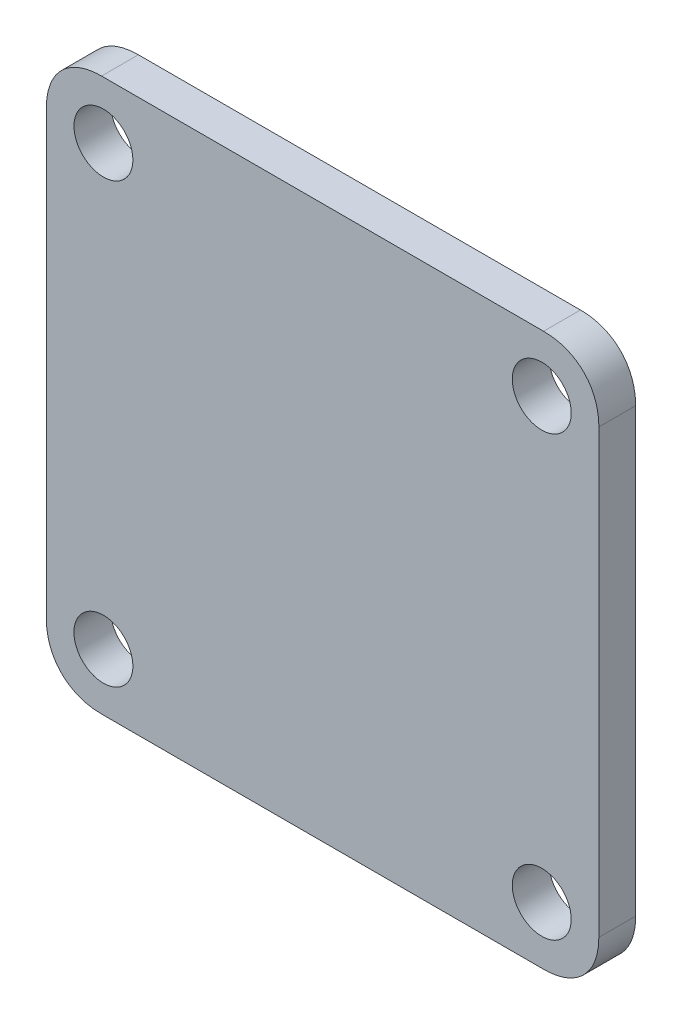
ISO-10303-21;
HEADER;
FILE_DESCRIPTION(('STEP AP214'),'2;1');
FILE_NAME('part.step','',(''),(''),'','','');
FILE_SCHEMA(('AUTOMOTIVE_DESIGN { 1 0 10303 214 1 1 1 1 }'));
ENDSEC;
DATA;
#1=APPLICATION_CONTEXT('core data for automotive mechanical design processes');
#2=APPLICATION_PROTOCOL_DEFINITION('international standard','automotive_design',2000,#1);
#3=PRODUCT_CONTEXT('',#1,'mechanical');
#4=PRODUCT('Part','Part','',(#3));
#5=PRODUCT_RELATED_PRODUCT_CATEGORY('part','',(#4));
#6=PRODUCT_DEFINITION_FORMATION('','',#4);
#7=PRODUCT_DEFINITION_CONTEXT('part definition',#1,'design');
#8=PRODUCT_DEFINITION('design','',#6,#7);
#9=PRODUCT_DEFINITION_SHAPE('','',#8);
#10=(LENGTH_UNIT() NAMED_UNIT(*) SI_UNIT(.MILLI.,.METRE.));
#11=(NAMED_UNIT(*) PLANE_ANGLE_UNIT() SI_UNIT($,.RADIAN.));
#12=(NAMED_UNIT(*) SI_UNIT($,.STERADIAN.) SOLID_ANGLE_UNIT());
#13=UNCERTAINTY_MEASURE_WITH_UNIT(LENGTH_MEASURE(1.E-05),#10,'distance_accuracy_value','');
#14=(GEOMETRIC_REPRESENTATION_CONTEXT(3) GLOBAL_UNCERTAINTY_ASSIGNED_CONTEXT((#13)) GLOBAL_UNIT_ASSIGNED_CONTEXT((#10,
#11,#12)) REPRESENTATION_CONTEXT('',''));
#15=CARTESIAN_POINT('',(0.,0.,0.));
#16=DIRECTION('',(0.,0.,1.));
#17=DIRECTION('',(1.,0.,0.));
#18=AXIS2_PLACEMENT_3D('',#15,#16,#17);
#19=CARTESIAN_POINT('',(0.,0.,2.));
#20=DIRECTION('',(0.,0.,1.));
#21=DIRECTION('',(1.,0.,0.));
#22=AXIS2_PLACEMENT_3D('',#19,#20,#21);
#23=PLANE('',#22);
#24=CARTESIAN_POINT('',(11.8999580326409,-11.8999580326409,2.));
#25=DIRECTION('',(0.,0.,1.));
#26=DIRECTION('',(1.,0.,0.));
#27=AXIS2_PLACEMENT_3D('',#24,#25,#26);
#28=CIRCLE('',#27,1.6);
#29=CARTESIAN_POINT('',(13.4999580326409,-11.8999580326409,2.));
#30=VERTEX_POINT('',#29);
#31=EDGE_CURVE('E273',#30,#30,#28,.T.);
#32=ORIENTED_EDGE('',*,*,#31,.F.);
#33=EDGE_LOOP('',(#32));
#34=FACE_BOUND('',#33,.T.);
#35=CARTESIAN_POINT('',(-11.8999580326409,11.8999580326409,2.));
#36=DIRECTION('',(0.,0.,1.));
#37=DIRECTION('',(1.,0.,0.));
#38=AXIS2_PLACEMENT_3D('',#35,#36,#37);
#39=CIRCLE('',#38,1.6);
#40=CARTESIAN_POINT('',(-10.2999580326409,11.8999580326409,2.));
#41=VERTEX_POINT('',#40);
#42=EDGE_CURVE('E178',#41,#41,#39,.T.);
#43=ORIENTED_EDGE('',*,*,#42,.F.);
#44=EDGE_LOOP('',(#43));
#45=FACE_BOUND('',#44,.T.);
#46=DIRECTION('',(0.,-1.,0.));
#47=VECTOR('',#46,1.);
#48=CARTESIAN_POINT('',(-15.,15.,2.));
#49=LINE('',#48,#47);
#50=CARTESIAN_POINT('',(-15.,12.,2.));
#51=VERTEX_POINT('',#50);
#52=CARTESIAN_POINT('',(-15.,-12.,2.));
#53=VERTEX_POINT('',#52);
#54=EDGE_CURVE('E166',#51,#53,#49,.T.);
#55=ORIENTED_EDGE('',*,*,#54,.T.);
#56=CARTESIAN_POINT('',(-12.,-15.,2.));
#57=CARTESIAN_POINT('',(-15.,-15.,2.));
#58=CARTESIAN_POINT('',(-15.,-12.,2.));
#59=(BOUNDED_CURVE() B_SPLINE_CURVE(2,(#56,#57,#58),.UNSPECIFIED.,.F.,
.F.) B_SPLINE_CURVE_WITH_KNOTS((3,3),(0.,1.),
.UNSPECIFIED.) CURVE() GEOMETRIC_REPRESENTATION_ITEM() RATIONAL_B_SPLINE_CURVE((1.,
0.818181818181818,1.)) REPRESENTATION_ITEM(''));
#60=CARTESIAN_POINT('',(-12.,-15.,2.));
#61=VERTEX_POINT('',#60);
#62=EDGE_CURVE('E464',#53,#61,#59,.F.);
#63=ORIENTED_EDGE('',*,*,#62,.T.);
#64=DIRECTION('',(1.,0.,0.));
#65=VECTOR('',#64,1.);
#66=CARTESIAN_POINT('',(-15.,-15.,2.));
#67=LINE('',#66,#65);
#68=CARTESIAN_POINT('',(12.,-15.,2.));
#69=VERTEX_POINT('',#68);
#70=EDGE_CURVE('E144',#61,#69,#67,.T.);
#71=ORIENTED_EDGE('',*,*,#70,.T.);
#72=CARTESIAN_POINT('',(15.,-12.,2.));
#73=CARTESIAN_POINT('',(15.,-15.,2.));
#74=CARTESIAN_POINT('',(12.,-15.,2.));
#75=(BOUNDED_CURVE() B_SPLINE_CURVE(2,(#72,#73,#74),.UNSPECIFIED.,.F.,
.F.) B_SPLINE_CURVE_WITH_KNOTS((3,3),(0.,1.),
.UNSPECIFIED.) CURVE() GEOMETRIC_REPRESENTATION_ITEM() RATIONAL_B_SPLINE_CURVE((1.,
0.818181818181818,1.)) REPRESENTATION_ITEM(''));
#76=CARTESIAN_POINT('',(15.,-12.,2.));
#77=VERTEX_POINT('',#76);
#78=EDGE_CURVE('E532',#69,#77,#75,.F.);
#79=ORIENTED_EDGE('',*,*,#78,.T.);
#80=DIRECTION('',(0.,1.,0.));
#81=VECTOR('',#80,1.);
#82=CARTESIAN_POINT('',(15.,15.,2.));
#83=LINE('',#82,#81);
#84=CARTESIAN_POINT('',(15.,12.,2.));
#85=VERTEX_POINT('',#84);
#86=EDGE_CURVE('E153',#77,#85,#83,.T.);
#87=ORIENTED_EDGE('',*,*,#86,.T.);
#88=CARTESIAN_POINT('',(12.,15.,2.));
#89=CARTESIAN_POINT('',(15.,15.,2.));
#90=CARTESIAN_POINT('',(15.,12.,2.));
#91=(BOUNDED_CURVE() B_SPLINE_CURVE(2,(#88,#89,#90),.UNSPECIFIED.,.F.,
.F.) B_SPLINE_CURVE_WITH_KNOTS((3,3),(0.,1.),
.UNSPECIFIED.) CURVE() GEOMETRIC_REPRESENTATION_ITEM() RATIONAL_B_SPLINE_CURVE((1.,
0.818181818181818,1.)) REPRESENTATION_ITEM(''));
#92=CARTESIAN_POINT('',(12.,15.,2.));
#93=VERTEX_POINT('',#92);
#94=EDGE_CURVE('E72',#85,#93,#91,.F.);
#95=ORIENTED_EDGE('',*,*,#94,.T.);
#96=DIRECTION('',(-1.,0.,0.));
#97=VECTOR('',#96,1.);
#98=CARTESIAN_POINT('',(-15.,15.,2.));
#99=LINE('',#98,#97);
#100=CARTESIAN_POINT('',(-12.,15.,2.));
#101=VERTEX_POINT('',#100);
#102=EDGE_CURVE('E156',#93,#101,#99,.T.);
#103=ORIENTED_EDGE('',*,*,#102,.T.);
#104=CARTESIAN_POINT('',(-15.,12.,2.));
#105=CARTESIAN_POINT('',(-15.,15.,2.));
#106=CARTESIAN_POINT('',(-12.,15.,2.));
#107=(BOUNDED_CURVE() B_SPLINE_CURVE(2,(#104,#105,#106),.UNSPECIFIED.,.F.,
.F.) B_SPLINE_CURVE_WITH_KNOTS((3,3),(0.,1.),
.UNSPECIFIED.) CURVE() GEOMETRIC_REPRESENTATION_ITEM() RATIONAL_B_SPLINE_CURVE((1.,
0.818181818181818,1.)) REPRESENTATION_ITEM(''));
#108=EDGE_CURVE('E584',#101,#51,#107,.F.);
#109=ORIENTED_EDGE('',*,*,#108,.T.);
#110=EDGE_LOOP('',(#55,#63,#71,#79,#87,#95,#103,#109));
#111=FACE_BOUND('',#110,.T.);
#112=CARTESIAN_POINT('',(11.8999580326409,11.8999580326409,2.));
#113=DIRECTION('',(0.,0.,1.));
#114=DIRECTION('',(-1.,0.,0.));
#115=AXIS2_PLACEMENT_3D('',#112,#113,#114);
#116=CIRCLE('',#115,1.6);
#117=CARTESIAN_POINT('',(10.2999580326409,11.8999580326409,2.));
#118=VERTEX_POINT('',#117);
#119=EDGE_CURVE('E267',#118,#118,#116,.T.);
#120=ORIENTED_EDGE('',*,*,#119,.F.);
#121=EDGE_LOOP('',(#120));
#122=FACE_BOUND('',#121,.T.);
#123=CARTESIAN_POINT('',(-11.8999580326409,-11.8999580326409,2.));
#124=DIRECTION('',(0.,0.,1.));
#125=DIRECTION('',(-1.,0.,0.));
#126=AXIS2_PLACEMENT_3D('',#123,#124,#125);
#127=CIRCLE('',#126,1.6);
#128=CARTESIAN_POINT('',(-13.4999580326409,-11.8999580326409,2.));
#129=VERTEX_POINT('',#128);
#130=EDGE_CURVE('E279',#129,#129,#127,.T.);
#131=ORIENTED_EDGE('',*,*,#130,.F.);
#132=EDGE_LOOP('',(#131));
#133=FACE_BOUND('',#132,.T.);
#134=ADVANCED_FACE('F44',(#34,#45,#111,#122,#133),#23,.T.);
#135=CARTESIAN_POINT('',(0.,0.,0.));
#136=DIRECTION('',(0.,0.,1.));
#137=DIRECTION('',(1.,0.,0.));
#138=AXIS2_PLACEMENT_3D('',#135,#136,#137);
#139=PLANE('',#138);
#140=DIRECTION('',(1.,0.,0.));
#141=VECTOR('',#140,1.);
#142=CARTESIAN_POINT('',(-15.,-15.,0.));
#143=LINE('',#142,#141);
#144=CARTESIAN_POINT('',(-12.,-15.,0.));
#145=VERTEX_POINT('',#144);
#146=CARTESIAN_POINT('',(12.,-15.,0.));
#147=VERTEX_POINT('',#146);
#148=EDGE_CURVE('E141',#145,#147,#143,.T.);
#149=ORIENTED_EDGE('',*,*,#148,.F.);
#150=CARTESIAN_POINT('',(-15.,-12.,0.));
#151=CARTESIAN_POINT('',(-15.,-15.,0.));
#152=CARTESIAN_POINT('',(-12.,-15.,0.));
#153=(BOUNDED_CURVE() B_SPLINE_CURVE(2,(#150,#151,#152),.UNSPECIFIED.,.F.,
.F.) B_SPLINE_CURVE_WITH_KNOTS((3,3),(0.,1.),
.UNSPECIFIED.) CURVE() GEOMETRIC_REPRESENTATION_ITEM() RATIONAL_B_SPLINE_CURVE((1.,
0.818181818181818,1.)) REPRESENTATION_ITEM(''));
#154=CARTESIAN_POINT('',(-15.,-12.,0.));
#155=VERTEX_POINT('',#154);
#156=EDGE_CURVE('E118',#145,#155,#153,.F.);
#157=ORIENTED_EDGE('',*,*,#156,.T.);
#158=DIRECTION('',(0.,-1.,0.));
#159=VECTOR('',#158,1.);
#160=CARTESIAN_POINT('',(-15.,15.,0.));
#161=LINE('',#160,#159);
#162=CARTESIAN_POINT('',(-15.,12.,0.));
#163=VERTEX_POINT('',#162);
#164=EDGE_CURVE('E154',#163,#155,#161,.T.);
#165=ORIENTED_EDGE('',*,*,#164,.F.);
#166=CARTESIAN_POINT('',(-12.,15.,0.));
#167=CARTESIAN_POINT('',(-15.,15.,0.));
#168=CARTESIAN_POINT('',(-15.,12.,0.));
#169=(BOUNDED_CURVE() B_SPLINE_CURVE(2,(#166,#167,#168),.UNSPECIFIED.,.F.,
.F.) B_SPLINE_CURVE_WITH_KNOTS((3,3),(0.,1.),
.UNSPECIFIED.) CURVE() GEOMETRIC_REPRESENTATION_ITEM() RATIONAL_B_SPLINE_CURVE((1.,
0.818181818181818,1.)) REPRESENTATION_ITEM(''));
#170=CARTESIAN_POINT('',(-12.,15.,0.));
#171=VERTEX_POINT('',#170);
#172=EDGE_CURVE('E145',#163,#171,#169,.F.);
#173=ORIENTED_EDGE('',*,*,#172,.T.);
#174=DIRECTION('',(-1.,0.,0.));
#175=VECTOR('',#174,1.);
#176=CARTESIAN_POINT('',(-15.,15.,0.));
#177=LINE('',#176,#175);
#178=CARTESIAN_POINT('',(12.,15.,0.));
#179=VERTEX_POINT('',#178);
#180=EDGE_CURVE('E158',#179,#171,#177,.T.);
#181=ORIENTED_EDGE('',*,*,#180,.F.);
#182=CARTESIAN_POINT('',(15.,12.,0.));
#183=CARTESIAN_POINT('',(15.,15.,0.));
#184=CARTESIAN_POINT('',(12.,15.,0.));
#185=(BOUNDED_CURVE() B_SPLINE_CURVE(2,(#182,#183,#184),.UNSPECIFIED.,.F.,
.F.) B_SPLINE_CURVE_WITH_KNOTS((3,3),(0.,1.),
.UNSPECIFIED.) CURVE() GEOMETRIC_REPRESENTATION_ITEM() RATIONAL_B_SPLINE_CURVE((1.,
0.818181818181818,1.)) REPRESENTATION_ITEM(''));
#186=CARTESIAN_POINT('',(15.,12.,0.));
#187=VERTEX_POINT('',#186);
#188=EDGE_CURVE('E456',#179,#187,#185,.F.);
#189=ORIENTED_EDGE('',*,*,#188,.T.);
#190=DIRECTION('',(0.,1.,0.));
#191=VECTOR('',#190,1.);
#192=CARTESIAN_POINT('',(15.,15.,0.));
#193=LINE('',#192,#191);
#194=CARTESIAN_POINT('',(15.,-12.,0.));
#195=VERTEX_POINT('',#194);
#196=EDGE_CURVE('E176',#195,#187,#193,.T.);
#197=ORIENTED_EDGE('',*,*,#196,.F.);
#198=CARTESIAN_POINT('',(12.,-15.,0.));
#199=CARTESIAN_POINT('',(15.,-15.,0.));
#200=CARTESIAN_POINT('',(15.,-12.,0.));
#201=(BOUNDED_CURVE() B_SPLINE_CURVE(2,(#198,#199,#200),.UNSPECIFIED.,.F.,
.F.) B_SPLINE_CURVE_WITH_KNOTS((3,3),(0.,1.),
.UNSPECIFIED.) CURVE() GEOMETRIC_REPRESENTATION_ITEM() RATIONAL_B_SPLINE_CURVE((1.,
0.818181818181818,1.)) REPRESENTATION_ITEM(''));
#202=EDGE_CURVE('E133',#195,#147,#201,.F.);
#203=ORIENTED_EDGE('',*,*,#202,.T.);
#204=EDGE_LOOP('',(#149,#157,#165,#173,#181,#189,#197,#203));
#205=FACE_BOUND('',#204,.T.);
#206=CARTESIAN_POINT('',(-11.8999580326409,11.8999580326409,0.));
#207=DIRECTION('',(0.,0.,1.));
#208=DIRECTION('',(1.,0.,0.));
#209=AXIS2_PLACEMENT_3D('',#206,#207,#208);
#210=CIRCLE('',#209,1.6);
#211=CARTESIAN_POINT('',(-10.2999580326409,11.8999580326409,0.));
#212=VERTEX_POINT('',#211);
#213=EDGE_CURVE('E263',#212,#212,#210,.T.);
#214=ORIENTED_EDGE('',*,*,#213,.T.);
#215=EDGE_LOOP('',(#214));
#216=FACE_BOUND('',#215,.T.);
#217=CARTESIAN_POINT('',(11.8999580326409,11.8999580326409,0.));
#218=DIRECTION('',(0.,0.,1.));
#219=DIRECTION('',(-1.,0.,0.));
#220=AXIS2_PLACEMENT_3D('',#217,#218,#219);
#221=CIRCLE('',#220,1.6);
#222=CARTESIAN_POINT('',(10.2999580326409,11.8999580326409,0.));
#223=VERTEX_POINT('',#222);
#224=EDGE_CURVE('E270',#223,#223,#221,.T.);
#225=ORIENTED_EDGE('',*,*,#224,.T.);
#226=EDGE_LOOP('',(#225));
#227=FACE_BOUND('',#226,.T.);
#228=CARTESIAN_POINT('',(11.8999580326409,-11.8999580326409,0.));
#229=DIRECTION('',(0.,0.,1.));
#230=DIRECTION('',(1.,0.,0.));
#231=AXIS2_PLACEMENT_3D('',#228,#229,#230);
#232=CIRCLE('',#231,1.6);
#233=CARTESIAN_POINT('',(13.4999580326409,-11.8999580326409,0.));
#234=VERTEX_POINT('',#233);
#235=EDGE_CURVE('E276',#234,#234,#232,.T.);
#236=ORIENTED_EDGE('',*,*,#235,.T.);
#237=EDGE_LOOP('',(#236));
#238=FACE_BOUND('',#237,.T.);
#239=CARTESIAN_POINT('',(-11.8999580326409,-11.8999580326409,0.));
#240=DIRECTION('',(0.,0.,1.));
#241=DIRECTION('',(-1.,0.,0.));
#242=AXIS2_PLACEMENT_3D('',#239,#240,#241);
#243=CIRCLE('',#242,1.6);
#244=CARTESIAN_POINT('',(-13.4999580326409,-11.8999580326409,0.));
#245=VERTEX_POINT('',#244);
#246=EDGE_CURVE('E282',#245,#245,#243,.T.);
#247=ORIENTED_EDGE('',*,*,#246,.T.);
#248=EDGE_LOOP('',(#247));
#249=FACE_BOUND('',#248,.T.);
#250=ADVANCED_FACE('F149',(#205,#216,#227,#238,#249),#139,.F.);
#251=CARTESIAN_POINT('',(15.,15.,2.));
#252=DIRECTION('',(-1.,0.,0.));
#253=DIRECTION('',(0.,-1.,0.));
#254=AXIS2_PLACEMENT_3D('',#251,#252,#253);
#255=PLANE('',#254);
#256=ORIENTED_EDGE('',*,*,#86,.F.);
#257=CARTESIAN_POINT('',(15.,-12.,-0.1));
#258=CARTESIAN_POINT('',(15.,-12.,0.633333333333333));
#259=CARTESIAN_POINT('',(15.,-12.,1.36666666666667));
#260=CARTESIAN_POINT('',(15.,-12.,2.1));
#261=(BOUNDED_CURVE() B_SPLINE_CURVE(3,(#257,#258,#259,#260),.UNSPECIFIED.,.F.,
.F.) B_SPLINE_CURVE_WITH_KNOTS((4,4),(-9.99999999999998E-05,0.0021),
.UNSPECIFIED.) CURVE() GEOMETRIC_REPRESENTATION_ITEM() RATIONAL_B_SPLINE_CURVE((1.,1.,1.,1.)) REPRESENTATION_ITEM(''));
#262=EDGE_CURVE('E461',#77,#195,#261,.F.);
#263=ORIENTED_EDGE('',*,*,#262,.T.);
#264=ORIENTED_EDGE('',*,*,#196,.T.);
#265=CARTESIAN_POINT('',(15.,12.,2.1));
#266=CARTESIAN_POINT('',(15.,12.,1.36666666666667));
#267=CARTESIAN_POINT('',(15.,12.,0.633333333333333));
#268=CARTESIAN_POINT('',(15.,12.,-0.1));
#269=(BOUNDED_CURVE() B_SPLINE_CURVE(3,(#265,#266,#267,#268),.UNSPECIFIED.,.F.,
.F.) B_SPLINE_CURVE_WITH_KNOTS((4,4),(-0.0001,0.0021),
.UNSPECIFIED.) CURVE() GEOMETRIC_REPRESENTATION_ITEM() RATIONAL_B_SPLINE_CURVE((1.,1.,1.,1.)) REPRESENTATION_ITEM(''));
#270=EDGE_CURVE('E459',#187,#85,#269,.F.);
#271=ORIENTED_EDGE('',*,*,#270,.T.);
#272=EDGE_LOOP('',(#256,#263,#264,#271));
#273=FACE_BOUND('',#272,.T.);
#274=ADVANCED_FACE('F200',(#273),#255,.F.);
#275=CARTESIAN_POINT('',(-15.,15.,2.));
#276=DIRECTION('',(0.,-1.,0.));
#277=DIRECTION('',(0.,0.,-1.));
#278=AXIS2_PLACEMENT_3D('',#275,#276,#277);
#279=PLANE('',#278);
#280=ORIENTED_EDGE('',*,*,#102,.F.);
#281=CARTESIAN_POINT('',(12.,15.,-0.1));
#282=CARTESIAN_POINT('',(12.,15.,0.633333333333333));
#283=CARTESIAN_POINT('',(12.,15.,1.36666666666667));
#284=CARTESIAN_POINT('',(12.,15.,2.1));
#285=(BOUNDED_CURVE() B_SPLINE_CURVE(3,(#281,#282,#283,#284),.UNSPECIFIED.,.F.,
.F.) B_SPLINE_CURVE_WITH_KNOTS((4,4),(-9.99999999999998E-05,0.0021),
.UNSPECIFIED.) CURVE() GEOMETRIC_REPRESENTATION_ITEM() RATIONAL_B_SPLINE_CURVE((1.,1.,1.,1.)) REPRESENTATION_ITEM(''));
#286=EDGE_CURVE('E12',#93,#179,#285,.F.);
#287=ORIENTED_EDGE('',*,*,#286,.T.);
#288=ORIENTED_EDGE('',*,*,#180,.T.);
#289=CARTESIAN_POINT('',(-12.,15.,2.1));
#290=CARTESIAN_POINT('',(-12.,15.,1.36666666666667));
#291=CARTESIAN_POINT('',(-12.,15.,0.633333333333333));
#292=CARTESIAN_POINT('',(-12.,15.,-0.1));
#293=(BOUNDED_CURVE() B_SPLINE_CURVE(3,(#289,#290,#291,#292),.UNSPECIFIED.,.F.,
.F.) B_SPLINE_CURVE_WITH_KNOTS((4,4),(-0.0001,0.0021),
.UNSPECIFIED.) CURVE() GEOMETRIC_REPRESENTATION_ITEM() RATIONAL_B_SPLINE_CURVE((1.,1.,1.,1.)) REPRESENTATION_ITEM(''));
#294=EDGE_CURVE('E58',#171,#101,#293,.F.);
#295=ORIENTED_EDGE('',*,*,#294,.T.);
#296=EDGE_LOOP('',(#280,#287,#288,#295));
#297=FACE_BOUND('',#296,.T.);
#298=ADVANCED_FACE('F247',(#297),#279,.F.);
#299=CARTESIAN_POINT('',(-15.,15.,2.));
#300=DIRECTION('',(1.,0.,0.));
#301=DIRECTION('',(0.,1.,0.));
#302=AXIS2_PLACEMENT_3D('',#299,#300,#301);
#303=PLANE('',#302);
#304=ORIENTED_EDGE('',*,*,#164,.T.);
#305=CARTESIAN_POINT('',(-15.,-12.,2.1));
#306=CARTESIAN_POINT('',(-15.,-12.,1.36666666666667));
#307=CARTESIAN_POINT('',(-15.,-12.,0.633333333333333));
#308=CARTESIAN_POINT('',(-15.,-12.,-0.1));
#309=(BOUNDED_CURVE() B_SPLINE_CURVE(3,(#305,#306,#307,#308),.UNSPECIFIED.,.F.,
.F.) B_SPLINE_CURVE_WITH_KNOTS((4,4),(-0.0001,0.0021),
.UNSPECIFIED.) CURVE() GEOMETRIC_REPRESENTATION_ITEM() RATIONAL_B_SPLINE_CURVE((1.,1.,1.,1.)) REPRESENTATION_ITEM(''));
#310=EDGE_CURVE('E125',#155,#53,#309,.F.);
#311=ORIENTED_EDGE('',*,*,#310,.T.);
#312=ORIENTED_EDGE('',*,*,#54,.F.);
#313=CARTESIAN_POINT('',(-15.,12.,-0.1));
#314=CARTESIAN_POINT('',(-15.,12.,0.633333333333333));
#315=CARTESIAN_POINT('',(-15.,12.,1.36666666666667));
#316=CARTESIAN_POINT('',(-15.,12.,2.1));
#317=(BOUNDED_CURVE() B_SPLINE_CURVE(3,(#313,#314,#315,#316),.UNSPECIFIED.,.F.,
.F.) B_SPLINE_CURVE_WITH_KNOTS((4,4),(-9.99999999999998E-05,0.0021),
.UNSPECIFIED.) CURVE() GEOMETRIC_REPRESENTATION_ITEM() RATIONAL_B_SPLINE_CURVE((1.,1.,1.,1.)) REPRESENTATION_ITEM(''));
#318=EDGE_CURVE('E132',#51,#163,#317,.F.);
#319=ORIENTED_EDGE('',*,*,#318,.T.);
#320=EDGE_LOOP('',(#304,#311,#312,#319));
#321=FACE_BOUND('',#320,.T.);
#322=ADVANCED_FACE('F238',(#321),#303,.F.);
#323=CARTESIAN_POINT('',(-15.,-15.,2.));
#324=DIRECTION('',(0.,1.,0.));
#325=DIRECTION('',(0.,0.,1.));
#326=AXIS2_PLACEMENT_3D('',#323,#324,#325);
#327=PLANE('',#326);
#328=ORIENTED_EDGE('',*,*,#70,.F.);
#329=CARTESIAN_POINT('',(-12.,-15.,-0.1));
#330=CARTESIAN_POINT('',(-12.,-15.,0.633333333333333));
#331=CARTESIAN_POINT('',(-12.,-15.,1.36666666666667));
#332=CARTESIAN_POINT('',(-12.,-15.,2.1));
#333=(BOUNDED_CURVE() B_SPLINE_CURVE(3,(#329,#330,#331,#332),.UNSPECIFIED.,.F.,
.F.) B_SPLINE_CURVE_WITH_KNOTS((4,4),(-9.99999999999998E-05,0.0021),
.UNSPECIFIED.) CURVE() GEOMETRIC_REPRESENTATION_ITEM() RATIONAL_B_SPLINE_CURVE((1.,1.,1.,1.)) REPRESENTATION_ITEM(''));
#334=EDGE_CURVE('E123',#61,#145,#333,.F.);
#335=ORIENTED_EDGE('',*,*,#334,.T.);
#336=ORIENTED_EDGE('',*,*,#148,.T.);
#337=CARTESIAN_POINT('',(12.,-15.,2.1));
#338=CARTESIAN_POINT('',(12.,-15.,1.36666666666667));
#339=CARTESIAN_POINT('',(12.,-15.,0.633333333333333));
#340=CARTESIAN_POINT('',(12.,-15.,-0.1));
#341=(BOUNDED_CURVE() B_SPLINE_CURVE(3,(#337,#338,#339,#340),.UNSPECIFIED.,.F.,
.F.) B_SPLINE_CURVE_WITH_KNOTS((4,4),(-0.0001,0.0021),
.UNSPECIFIED.) CURVE() GEOMETRIC_REPRESENTATION_ITEM() RATIONAL_B_SPLINE_CURVE((1.,1.,1.,1.)) REPRESENTATION_ITEM(''));
#342=EDGE_CURVE('E146',#147,#69,#341,.F.);
#343=ORIENTED_EDGE('',*,*,#342,.T.);
#344=EDGE_LOOP('',(#328,#335,#336,#343));
#345=FACE_BOUND('',#344,.T.);
#346=ADVANCED_FACE('F140',(#345),#327,.F.);
#347=CARTESIAN_POINT('',(-11.8999580326409,11.8999580326409,2.));
#348=DIRECTION('',(0.,0.,-1.));
#349=DIRECTION('',(-1.,0.,0.));
#350=AXIS2_PLACEMENT_3D('',#347,#348,#349);
#351=CYLINDRICAL_SURFACE('',#350,1.6);
#352=ORIENTED_EDGE('',*,*,#42,.T.);
#353=EDGE_LOOP('',(#352));
#354=FACE_BOUND('',#353,.T.);
#355=ORIENTED_EDGE('',*,*,#213,.F.);
#356=EDGE_LOOP('',(#355));
#357=FACE_BOUND('',#356,.T.);
#358=ADVANCED_FACE('F306',(#354,#357),#351,.F.);
#359=CARTESIAN_POINT('',(11.8999580326409,11.8999580326409,2.));
#360=DIRECTION('',(0.,0.,-1.));
#361=DIRECTION('',(-1.,0.,0.));
#362=AXIS2_PLACEMENT_3D('',#359,#360,#361);
#363=CYLINDRICAL_SURFACE('',#362,1.6);
#364=ORIENTED_EDGE('',*,*,#119,.T.);
#365=EDGE_LOOP('',(#364));
#366=FACE_BOUND('',#365,.T.);
#367=ORIENTED_EDGE('',*,*,#224,.F.);
#368=EDGE_LOOP('',(#367));
#369=FACE_BOUND('',#368,.T.);
#370=ADVANCED_FACE('F302',(#366,#369),#363,.F.);
#371=CARTESIAN_POINT('',(11.8999580326409,-11.8999580326409,2.));
#372=DIRECTION('',(0.,0.,-1.));
#373=DIRECTION('',(-1.,0.,0.));
#374=AXIS2_PLACEMENT_3D('',#371,#372,#373);
#375=CYLINDRICAL_SURFACE('',#374,1.6);
#376=ORIENTED_EDGE('',*,*,#31,.T.);
#377=EDGE_LOOP('',(#376));
#378=FACE_BOUND('',#377,.T.);
#379=ORIENTED_EDGE('',*,*,#235,.F.);
#380=EDGE_LOOP('',(#379));
#381=FACE_BOUND('',#380,.T.);
#382=ADVANCED_FACE('F305',(#378,#381),#375,.F.);
#383=CARTESIAN_POINT('',(-11.8999580326409,-11.8999580326409,2.));
#384=DIRECTION('',(0.,0.,-1.));
#385=DIRECTION('',(-1.,0.,0.));
#386=AXIS2_PLACEMENT_3D('',#383,#384,#385);
#387=CYLINDRICAL_SURFACE('',#386,1.6);
#388=ORIENTED_EDGE('',*,*,#130,.T.);
#389=EDGE_LOOP('',(#388));
#390=FACE_BOUND('',#389,.T.);
#391=ORIENTED_EDGE('',*,*,#246,.F.);
#392=EDGE_LOOP('',(#391));
#393=FACE_BOUND('',#392,.T.);
#394=ADVANCED_FACE('F288',(#390,#393),#387,.F.);
#395=CARTESIAN_POINT('',(-12.,-15.,2.1));
#396=CARTESIAN_POINT('',(-12.,-15.,1.36666666666667));
#397=CARTESIAN_POINT('',(-12.,-15.,0.633333333333333));
#398=CARTESIAN_POINT('',(-12.,-15.,-0.1));
#399=CARTESIAN_POINT('',(-15.,-15.,2.1));
#400=CARTESIAN_POINT('',(-15.,-15.,1.36666666666667));
#401=CARTESIAN_POINT('',(-15.,-15.,0.633333333333333));
#402=CARTESIAN_POINT('',(-15.,-15.,-0.1));
#403=CARTESIAN_POINT('',(-15.,-12.,2.1));
#404=CARTESIAN_POINT('',(-15.,-12.,1.36666666666667));
#405=CARTESIAN_POINT('',(-15.,-12.,0.633333333333333));
#406=CARTESIAN_POINT('',(-15.,-12.,-0.1));
#407=(BOUNDED_SURFACE() B_SPLINE_SURFACE(2,3,((#395,#396,#397,#398),(#399,#400,#401,#402),(#403,
#404,#405,#406)),.UNSPECIFIED.,.F.,.F.,.F.) B_SPLINE_SURFACE_WITH_KNOTS((3,3),(4,4),(0.,1.),
(-0.0001,0.0021),.UNSPECIFIED.) GEOMETRIC_REPRESENTATION_ITEM() RATIONAL_B_SPLINE_SURFACE(((1.,
1.,1.,1.),(0.818181818181818,0.818181818181818,0.818181818181818,0.818181818181818),(1.,1.,1.,1.))) REPRESENTATION_ITEM('') SURFACE());
#408=ORIENTED_EDGE('',*,*,#62,.F.);
#409=ORIENTED_EDGE('',*,*,#310,.F.);
#410=ORIENTED_EDGE('',*,*,#156,.F.);
#411=ORIENTED_EDGE('',*,*,#334,.F.);
#412=EDGE_LOOP('',(#408,#409,#410,#411));
#413=FACE_BOUND('',#412,.T.);
#414=ADVANCED_FACE('F122',(#413),#407,.T.);
#415=CARTESIAN_POINT('',(15.,-12.,2.1));
#416=CARTESIAN_POINT('',(15.,-12.,1.36666666666667));
#417=CARTESIAN_POINT('',(15.,-12.,0.633333333333333));
#418=CARTESIAN_POINT('',(15.,-12.,-0.1));
#419=CARTESIAN_POINT('',(15.,-15.,2.1));
#420=CARTESIAN_POINT('',(15.,-15.,1.36666666666667));
#421=CARTESIAN_POINT('',(15.,-15.,0.633333333333333));
#422=CARTESIAN_POINT('',(15.,-15.,-0.1));
#423=CARTESIAN_POINT('',(12.,-15.,2.1));
#424=CARTESIAN_POINT('',(12.,-15.,1.36666666666667));
#425=CARTESIAN_POINT('',(12.,-15.,0.633333333333333));
#426=CARTESIAN_POINT('',(12.,-15.,-0.1));
#427=(BOUNDED_SURFACE() B_SPLINE_SURFACE(2,3,((#415,#416,#417,#418),(#419,#420,#421,#422),(#423,
#424,#425,#426)),.UNSPECIFIED.,.F.,.F.,.F.) B_SPLINE_SURFACE_WITH_KNOTS((3,3),(4,4),(0.,1.),
(-0.0001,0.0021),.UNSPECIFIED.) GEOMETRIC_REPRESENTATION_ITEM() RATIONAL_B_SPLINE_SURFACE(((1.,
1.,1.,1.),(0.818181818181818,0.818181818181818,0.818181818181818,0.818181818181818),(1.,1.,1.,1.))) REPRESENTATION_ITEM('') SURFACE());
#428=ORIENTED_EDGE('',*,*,#78,.F.);
#429=ORIENTED_EDGE('',*,*,#342,.F.);
#430=ORIENTED_EDGE('',*,*,#202,.F.);
#431=ORIENTED_EDGE('',*,*,#262,.F.);
#432=EDGE_LOOP('',(#428,#429,#430,#431));
#433=FACE_BOUND('',#432,.T.);
#434=ADVANCED_FACE('F319',(#433),#427,.T.);
#435=CARTESIAN_POINT('',(12.,15.,2.1));
#436=CARTESIAN_POINT('',(12.,15.,1.36666666666667));
#437=CARTESIAN_POINT('',(12.,15.,0.633333333333333));
#438=CARTESIAN_POINT('',(12.,15.,-0.1));
#439=CARTESIAN_POINT('',(15.,15.,2.1));
#440=CARTESIAN_POINT('',(15.,15.,1.36666666666667));
#441=CARTESIAN_POINT('',(15.,15.,0.633333333333333));
#442=CARTESIAN_POINT('',(15.,15.,-0.1));
#443=CARTESIAN_POINT('',(15.,12.,2.1));
#444=CARTESIAN_POINT('',(15.,12.,1.36666666666667));
#445=CARTESIAN_POINT('',(15.,12.,0.633333333333333));
#446=CARTESIAN_POINT('',(15.,12.,-0.1));
#447=(BOUNDED_SURFACE() B_SPLINE_SURFACE(2,3,((#435,#436,#437,#438),(#439,#440,#441,#442),(#443,
#444,#445,#446)),.UNSPECIFIED.,.F.,.F.,.F.) B_SPLINE_SURFACE_WITH_KNOTS((3,3),(4,4),(0.,1.),
(-0.0001,0.0021),.UNSPECIFIED.) GEOMETRIC_REPRESENTATION_ITEM() RATIONAL_B_SPLINE_SURFACE(((1.,
1.,1.,1.),(0.818181818181818,0.818181818181818,0.818181818181818,0.818181818181818),(1.,1.,1.,1.))) REPRESENTATION_ITEM('') SURFACE());
#448=ORIENTED_EDGE('',*,*,#94,.F.);
#449=ORIENTED_EDGE('',*,*,#270,.F.);
#450=ORIENTED_EDGE('',*,*,#188,.F.);
#451=ORIENTED_EDGE('',*,*,#286,.F.);
#452=EDGE_LOOP('',(#448,#449,#450,#451));
#453=FACE_BOUND('',#452,.T.);
#454=ADVANCED_FACE('F347',(#453),#447,.T.);
#455=CARTESIAN_POINT('',(-15.,12.,2.1));
#456=CARTESIAN_POINT('',(-15.,12.,1.36666666666667));
#457=CARTESIAN_POINT('',(-15.,12.,0.633333333333333));
#458=CARTESIAN_POINT('',(-15.,12.,-0.1));
#459=CARTESIAN_POINT('',(-15.,15.,2.1));
#460=CARTESIAN_POINT('',(-15.,15.,1.36666666666667));
#461=CARTESIAN_POINT('',(-15.,15.,0.633333333333333));
#462=CARTESIAN_POINT('',(-15.,15.,-0.1));
#463=CARTESIAN_POINT('',(-12.,15.,2.1));
#464=CARTESIAN_POINT('',(-12.,15.,1.36666666666667));
#465=CARTESIAN_POINT('',(-12.,15.,0.633333333333333));
#466=CARTESIAN_POINT('',(-12.,15.,-0.1));
#467=(BOUNDED_SURFACE() B_SPLINE_SURFACE(2,3,((#455,#456,#457,#458),(#459,#460,#461,#462),(#463,
#464,#465,#466)),.UNSPECIFIED.,.F.,.F.,.F.) B_SPLINE_SURFACE_WITH_KNOTS((3,3),(4,4),(0.,1.),
(-0.0001,0.0021),.UNSPECIFIED.) GEOMETRIC_REPRESENTATION_ITEM() RATIONAL_B_SPLINE_SURFACE(((1.,
1.,1.,1.),(0.818181818181818,0.818181818181818,0.818181818181818,0.818181818181818),(1.,1.,1.,1.))) REPRESENTATION_ITEM('') SURFACE());
#468=ORIENTED_EDGE('',*,*,#108,.F.);
#469=ORIENTED_EDGE('',*,*,#294,.F.);
#470=ORIENTED_EDGE('',*,*,#172,.F.);
#471=ORIENTED_EDGE('',*,*,#318,.F.);
#472=EDGE_LOOP('',(#468,#469,#470,#471));
#473=FACE_BOUND('',#472,.T.);
#474=ADVANCED_FACE('F47',(#473),#467,.T.);
#475=CLOSED_SHELL('',(#134,#250,#274,#298,#322,#346,#358,#370,#382,#394,#414,#434,#454,#474));
#476=MANIFOLD_SOLID_BREP('B2',#475);
#477=ADVANCED_BREP_SHAPE_REPRESENTATION('',(#18,#476),#14);
#478=SHAPE_DEFINITION_REPRESENTATION(#9,#477);
ENDSEC;
END-ISO-10303-21;
